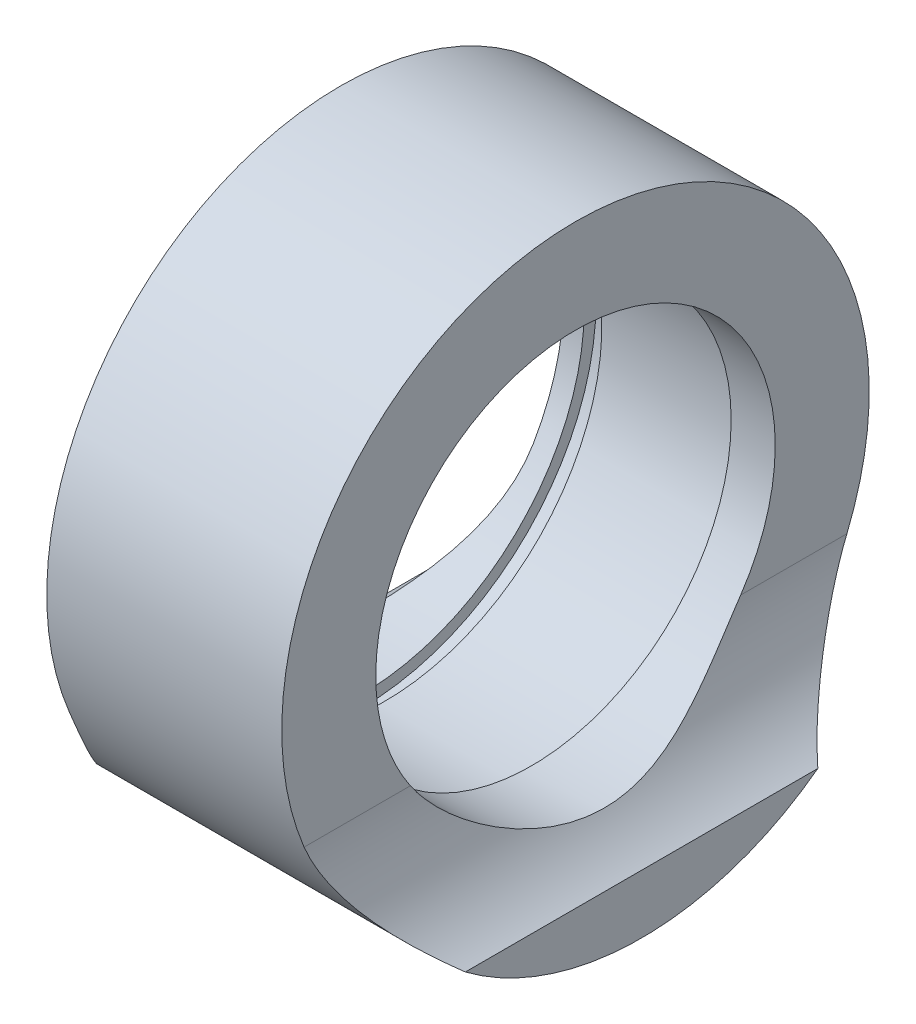
ISO-10303-21;
HEADER;
FILE_DESCRIPTION(('STEP AP214'),'2;1');
FILE_NAME('part.step','',(''),(''),'','','');
FILE_SCHEMA(('AUTOMOTIVE_DESIGN { 1 0 10303 214 1 1 1 1 }'));
ENDSEC;
DATA;
#1=APPLICATION_CONTEXT('core data for automotive mechanical design processes');
#2=APPLICATION_PROTOCOL_DEFINITION('international standard','automotive_design',2000,#1);
#3=PRODUCT_CONTEXT('',#1,'mechanical');
#4=PRODUCT('Part','Part','',(#3));
#5=PRODUCT_RELATED_PRODUCT_CATEGORY('part','',(#4));
#6=PRODUCT_DEFINITION_FORMATION('','',#4);
#7=PRODUCT_DEFINITION_CONTEXT('part definition',#1,'design');
#8=PRODUCT_DEFINITION('design','',#6,#7);
#9=PRODUCT_DEFINITION_SHAPE('','',#8);
#10=(LENGTH_UNIT() NAMED_UNIT(*) SI_UNIT(.MILLI.,.METRE.));
#11=(NAMED_UNIT(*) PLANE_ANGLE_UNIT() SI_UNIT($,.RADIAN.));
#12=(NAMED_UNIT(*) SI_UNIT($,.STERADIAN.) SOLID_ANGLE_UNIT());
#13=UNCERTAINTY_MEASURE_WITH_UNIT(LENGTH_MEASURE(1.E-05),#10,'distance_accuracy_value','');
#14=(GEOMETRIC_REPRESENTATION_CONTEXT(3) GLOBAL_UNCERTAINTY_ASSIGNED_CONTEXT((#13)) GLOBAL_UNIT_ASSIGNED_CONTEXT((#10,
#11,#12)) REPRESENTATION_CONTEXT('',''));
#15=CARTESIAN_POINT('',(0.,0.,0.));
#16=DIRECTION('',(0.,0.,1.));
#17=DIRECTION('',(1.,0.,0.));
#18=AXIS2_PLACEMENT_3D('',#15,#16,#17);
#19=CARTESIAN_POINT('',(0.,0.,0.));
#20=DIRECTION('',(-1.,0.,0.));
#21=DIRECTION('',(0.,0.,1.));
#22=AXIS2_PLACEMENT_3D('',#19,#20,#21);
#23=CYLINDRICAL_SURFACE('',#22,8.636);
#24=CARTESIAN_POINT('',(11.1125,0.,0.));
#25=DIRECTION('',(-1.,0.,0.));
#26=DIRECTION('',(0.,0.,1.));
#27=AXIS2_PLACEMENT_3D('',#24,#25,#26);
#28=CIRCLE('',#27,8.636);
#29=CARTESIAN_POINT('',(11.1125,0.,8.636));
#30=VERTEX_POINT('',#29);
#31=EDGE_CURVE('E114',#30,#30,#28,.T.);
#32=ORIENTED_EDGE('',*,*,#31,.T.);
#33=EDGE_LOOP('',(#32));
#34=FACE_BOUND('',#33,.T.);
#35=CARTESIAN_POINT('',(15.875,0.446591111191196,-8.62444504761929));
#36=CARTESIAN_POINT('',(15.7386835932606,0.356840111444014,-8.62908837791533));
#37=CARTESIAN_POINT('',(15.6058029292573,0.261777067663631,-8.6326104311476));
#38=CARTESIAN_POINT('',(15.3476728732243,0.061640290897859,-8.63636131849415));
#39=CARTESIAN_POINT('',(15.2224267012754,-0.0434376189138688,-8.63658877245093));
#40=CARTESIAN_POINT('',(14.9800981710596,-0.263225367313131,-8.63268862563732));
#41=CARTESIAN_POINT('',(14.8630399493304,-0.377961653112279,-8.62854868357998));
#42=CARTESIAN_POINT('',(14.6383005330475,-0.61595574163504,-8.61483011001896));
#43=CARTESIAN_POINT('',(14.5306179648788,-0.739212291302738,-8.60525227676542));
#44=CARTESIAN_POINT('',(14.3249950767909,-0.993738360237318,-8.57959180813219));
#45=CARTESIAN_POINT('',(14.2270923298923,-1.12503587549605,-8.5634852040398));
#46=CARTESIAN_POINT('',(14.0421861092395,-1.39402299325228,-8.52382957690333));
#47=CARTESIAN_POINT('',(13.9551817675209,-1.531712085517,-8.50028114706364));
#48=CARTESIAN_POINT('',(13.7927996373322,-1.8118127766683,-8.44500803920571));
#49=CARTESIAN_POINT('',(13.7173973883662,-1.95421364915758,-8.41330095010709));
#50=CARTESIAN_POINT('',(13.578374257973,-2.24248837109038,-8.34109179197295));
#51=CARTESIAN_POINT('',(13.5147525006629,-2.38836196142545,-8.30059037728497));
#52=CARTESIAN_POINT('',(13.4031062845983,-2.67259877804348,-8.21330545907054));
#53=CARTESIAN_POINT('',(13.3543457652233,-2.81084751233822,-8.16708749125598));
#54=CARTESIAN_POINT('',(13.2671755575948,-3.08763879038732,-8.06651479957894));
#55=CARTESIAN_POINT('',(13.2287654241793,-3.22618132124732,-8.01216042581348));
#56=CARTESIAN_POINT('',(13.1619804431395,-3.50236745000247,-7.89534143479578));
#57=CARTESIAN_POINT('',(13.1336123607673,-3.6400103807998,-7.83287138866328));
#58=CARTESIAN_POINT('',(13.0864684844619,-3.91312108365166,-7.70006745370994));
#59=CARTESIAN_POINT('',(13.0676930011197,-4.04858878513869,-7.62973331035375));
#60=CARTESIAN_POINT('',(13.039039445284,-4.31691098390736,-7.48120306433948));
#61=CARTESIAN_POINT('',(13.0292022571077,-4.44975078133122,-7.40297263598532));
#62=CARTESIAN_POINT('',(13.0178135698941,-4.71133788168945,-7.23930992224698));
#63=CARTESIAN_POINT('',(13.016265263719,-4.84008358860819,-7.15387487452615));
#64=CARTESIAN_POINT('',(13.0206296184562,-5.09270269643648,-6.9762964130303));
#65=CARTESIAN_POINT('',(13.0265417365652,-5.21657645114186,-6.88415348776455));
#66=CARTESIAN_POINT('',(13.0449520783449,-5.45891928589762,-6.69361417757654));
#67=CARTESIAN_POINT('',(13.0574516785455,-5.57738723071792,-6.5952164894303));
#68=CARTESIAN_POINT('',(13.0952308697126,-5.86175917005443,-6.34591617290475));
#69=CARTESIAN_POINT('',(13.1237454777848,-6.02436070256196,-6.19171635611456));
#70=CARTESIAN_POINT('',(13.1902011265302,-6.33620374625878,-5.87221461771951));
#71=CARTESIAN_POINT('',(13.2281458271049,-6.48544003961799,-5.70690840384285));
#72=CARTESIAN_POINT('',(13.3108653687393,-6.77026431550994,-5.36595420106999));
#73=CARTESIAN_POINT('',(13.3556544057455,-6.90582293568344,-5.19028519454096));
#74=CARTESIAN_POINT('',(13.4493729495069,-7.16255468970004,-4.82983132116994));
#75=CARTESIAN_POINT('',(13.4983020946299,-7.28372907776734,-4.64504725110205));
#76=CARTESIAN_POINT('',(13.5987136260332,-7.51370657092106,-4.26325797451027));
#77=CARTESIAN_POINT('',(13.6502275755501,-7.6222117348781,-4.06608168813924));
#78=CARTESIAN_POINT('',(13.7521288209307,-7.82366511831788,-3.66352840847275));
#79=CARTESIAN_POINT('',(13.8025155779437,-7.91660602946936,-3.45814761842808));
#80=CARTESIAN_POINT('',(13.8992571060266,-8.08630959689064,-3.04021183291701));
#81=CARTESIAN_POINT('',(13.9456172906767,-8.16309417885237,-2.82766702046186));
#82=CARTESIAN_POINT('',(14.0315365811996,-8.30003668030455,-2.39605831299453));
#83=CARTESIAN_POINT('',(14.0710999835619,-8.36020511817871,-2.17699863977688));
#84=CARTESIAN_POINT('',(14.1364157557333,-8.45687431911585,-1.76110153901012));
#85=CARTESIAN_POINT('',(14.1632761470136,-8.49539301493192,-1.56490764973633));
#86=CARTESIAN_POINT('',(14.2081963104874,-8.55881262088339,-1.16932974567974));
#87=CARTESIAN_POINT('',(14.2262570128608,-8.58371497038219,-0.969946070378679));
#88=CARTESIAN_POINT('',(14.2524213266798,-8.6195447837965,-0.569481708757995));
#89=CARTESIAN_POINT('',(14.2605356379583,-8.63048726556103,-0.368403080745886));
#90=CARTESIAN_POINT('',(14.266302013592,-8.63827876270813,0.0341818054022836));
#91=CARTESIAN_POINT('',(14.263954027761,-8.63512771048593,0.235688065585003));
#92=CARTESIAN_POINT('',(14.2489599967447,-8.61478954204369,0.637432088607044));
#93=CARTESIAN_POINT('',(14.2363223504963,-8.5976138733863,0.837670751833047));
#94=CARTESIAN_POINT('',(14.2015859734294,-8.54949550909761,1.23564153197928));
#95=CARTESIAN_POINT('',(14.1794869036746,-8.51855232027111,1.43337355884302));
#96=CARTESIAN_POINT('',(14.1271392932898,-8.44323706384901,1.82541224839836));
#97=CARTESIAN_POINT('',(14.0968807785084,-8.39884855237354,2.01971440660158));
#98=CARTESIAN_POINT('',(14.0299094235879,-8.29710177122301,2.40377141712323));
#99=CARTESIAN_POINT('',(13.9931938338301,-8.23973797328706,2.59352429294657));
#100=CARTESIAN_POINT('',(13.8718058099806,-8.04177152802063,3.17556668216729));
#101=CARTESIAN_POINT('',(13.7791053248842,-7.87940801392418,3.55909402358116));
#102=CARTESIAN_POINT('',(13.6379791923144,-7.59645298795817,4.11309228965697));
#103=CARTESIAN_POINT('',(13.5905686158555,-7.49550998076479,4.29428924343374));
#104=CARTESIAN_POINT('',(13.4971697815103,-7.28063504201798,4.64928511274541));
#105=CARTESIAN_POINT('',(13.4511815420772,-7.16670294203443,4.82308393230825));
#106=CARTESIAN_POINT('',(13.3627323185049,-6.92594164614846,5.16287384158015));
#107=CARTESIAN_POINT('',(13.3202769414156,-6.79909263327571,5.32885234507323));
#108=CARTESIAN_POINT('',(13.2411761597273,-6.53298395346176,5.65193623793015));
#109=CARTESIAN_POINT('',(13.2045284178938,-6.39372931448884,5.80904518030456));
#110=CARTESIAN_POINT('',(13.1392968756995,-6.10334431929646,6.11341826619848));
#111=CARTESIAN_POINT('',(13.1107055007745,-5.95222529004746,6.26069155706601));
#112=CARTESIAN_POINT('',(13.0638438607136,-5.63870317766427,6.54447776143717));
#113=CARTESIAN_POINT('',(13.0455707635691,-5.47630320451304,6.68099361862269));
#114=CARTESIAN_POINT('',(13.0242404615752,-5.17748094888718,6.9138937045802));
#115=CARTESIAN_POINT('',(13.0187497974967,-5.04302065593645,7.01257868551938));
#116=CARTESIAN_POINT('',(13.0166297227507,-4.76857008746659,7.20201491019405));
#117=CARTESIAN_POINT('',(13.019998229266,-4.62858111937717,7.29276801355413));
#118=CARTESIAN_POINT('',(13.0366237513185,-4.34406410677281,7.46574212987066));
#119=CARTESIAN_POINT('',(13.0498762059486,-4.19953818527228,7.54796705819046));
#120=CARTESIAN_POINT('',(13.0871807395849,-3.90706306188007,7.70342632797614));
#121=CARTESIAN_POINT('',(13.1112329223403,-3.75911382711473,7.77666058306311));
#122=CARTESIAN_POINT('',(13.1710609901946,-3.46027984252363,7.91417559672029));
#123=CARTESIAN_POINT('',(13.2069079873853,-3.30938264280664,7.97839858947061));
#124=CARTESIAN_POINT('',(13.2908022191941,-3.00715437433918,8.09715253984664));
#125=CARTESIAN_POINT('',(13.3388495521268,-2.85582330210215,8.15168341936389));
#126=CARTESIAN_POINT('',(13.4473685147598,-2.55449247627678,8.25107449442493));
#127=CARTESIAN_POINT('',(13.5078368552093,-2.4044923811757,8.29593724378863));
#128=CARTESIAN_POINT('',(13.6411553641944,-2.1075297974248,8.37630435299449));
#129=CARTESIAN_POINT('',(13.7140045777955,-1.96056707548274,8.4118094340535));
#130=CARTESIAN_POINT('',(13.8642475687794,-1.6851221990593,8.47105553364385));
#131=CARTESIAN_POINT('',(13.9405482297414,-1.55621274671188,8.49559477178638));
#132=CARTESIAN_POINT('',(14.1026345997315,-1.30336177058503,8.53804305409211));
#133=CARTESIAN_POINT('',(14.1884205171535,-1.17942035603643,8.55595195254716));
#134=CARTESIAN_POINT('',(14.3690207539414,-0.937456539666256,8.5858337249806));
#135=CARTESIAN_POINT('',(14.4638393928683,-0.819437011369438,8.59780374175248));
#136=CARTESIAN_POINT('',(14.6618570228486,-0.590280853529636,8.61657047110976));
#137=CARTESIAN_POINT('',(14.7650548801957,-0.479143296432244,8.62336788226094));
#138=CARTESIAN_POINT('',(15.0249762143924,-0.218630318238057,8.63459230249568));
#139=CARTESIAN_POINT('',(15.1857595163899,-0.073157585017538,8.63677259790328));
#140=CARTESIAN_POINT('',(15.4370782461694,0.131879005051615,8.6352631428738));
#141=CARTESIAN_POINT('',(15.5224280815262,0.197954247816162,8.63396796177534));
#142=CARTESIAN_POINT('',(15.6963461419522,0.325645707847543,8.63009375884582));
#143=CARTESIAN_POINT('',(15.7849136981537,0.387262843944688,8.62751500243211));
#144=CARTESIAN_POINT('',(15.875,0.446591111191195,8.62444504761929));
#145=B_SPLINE_CURVE_WITH_KNOTS('',3,(#35,#36,#37,#38,#39,#40,#41,#42,#43,#44,#45,#46,#47,#48,
#49,#50,#51,#52,#53,#54,#55,#56,#57,#58,#59,#60,#61,#62,#63,#64,#65,#66,#67,#68,#69,#70,#71,#72,
#73,#74,#75,#76,#77,#78,#79,#80,#81,#82,#83,#84,#85,#86,#87,#88,#89,#90,#91,#92,#93,#94,#95,#96,
#97,#98,#99,#100,#101,#102,#103,#104,#105,#106,#107,#108,#109,#110,#111,#112,#113,#114,#115,
#116,#117,#118,#119,#120,#121,#122,#123,#124,#125,#126,#127,#128,#129,#130,#131,#132,#133,#134,
#135,#136,#137,#138,#139,#140,#141,#142,#143,#144),.UNSPECIFIED.,.F.,.F.,(4,2,2,2,2,2,2,2,2,2,2,
2,2,2,2,2,2,2,2,2,2,2,2,2,2,2,2,2,2,2,2,2,2,2,2,2,2,2,2,2,2,2,2,2,2,2,2,2,2,2,2,2,2,2,4),(0.,
0.48973262451988,0.979670399516991,1.47099634720444,1.96225018979995,2.45532411994016,
2.94835875597723,3.44033925655577,3.9322831635399,4.39284621093674,4.85338944670844,
5.31424235904811,5.77511019202395,6.23807560375113,6.70121933608205,7.16432937308854,
7.62753622064424,8.30423310023355,8.98119302307462,9.65957659015764,10.3379009624901,
11.0298723472358,11.722167747643,12.4135174890789,13.104428582526,13.7090073993534,
14.3135222947067,14.9173863106715,15.5212532232935,16.1246277230088,16.7280238392079,
17.33216092035,17.9365558870861,19.2112299830459,19.8491632765385,20.4871048430806,
21.1260403149325,21.7647179958897,22.4027931755939,23.040693140605,23.5408610558507,
24.0409113906576,24.5407311219639,25.040555654969,25.5434506552297,26.046349708123,
26.5491157578312,27.0518430468739,27.5067041842743,27.9615753170967,28.4166650775364,
28.8716933667165,29.5207507104857,29.8444660370683,30.1681144536797),.UNSPECIFIED.);
#146=CARTESIAN_POINT('',(13.0175,-4.8567044444044,-7.14093256792854));
#147=VERTEX_POINT('',#146);
#148=CARTESIAN_POINT('',(13.0175,-4.8567044444044,7.14093256792854));
#149=VERTEX_POINT('',#148);
#150=EDGE_CURVE('E111',#147,#149,#145,.T.);
#151=ORIENTED_EDGE('',*,*,#150,.F.);
#152=CARTESIAN_POINT('',(13.0175,0.,0.));
#153=DIRECTION('',(-1.,0.,0.));
#154=DIRECTION('',(0.,-1.,0.));
#155=AXIS2_PLACEMENT_3D('',#152,#153,#154);
#156=CIRCLE('',#155,8.636);
#157=EDGE_CURVE('E105',#147,#149,#156,.F.);
#158=ORIENTED_EDGE('',*,*,#157,.T.);
#159=EDGE_LOOP('',(#151,#158));
#160=FACE_BOUND('',#159,.T.);
#161=ADVANCED_FACE('F38',(#34,#160),#23,.F.);
#162=CARTESIAN_POINT('',(0.,0.,0.));
#163=DIRECTION('',(-1.,0.,0.));
#164=DIRECTION('',(0.,0.,1.));
#165=AXIS2_PLACEMENT_3D('',#162,#163,#164);
#166=CYLINDRICAL_SURFACE('',#165,9.652);
#167=CARTESIAN_POINT('',(2.8575,-4.8567044444044,-8.3410746273908));
#168=CARTESIAN_POINT('',(2.85750036353043,-4.95083609844795,-8.28626756260821));
#169=CARTESIAN_POINT('',(2.85540678181921,-5.04401631588028,-8.22987562631701));
#170=CARTESIAN_POINT('',(2.84729008677914,-5.22827375131148,-8.11406737343164));
#171=CARTESIAN_POINT('',(2.84126791739386,-5.31935146904812,-8.05465178650783));
#172=CARTESIAN_POINT('',(2.81772645001285,-5.58882975935709,-7.87229601799823));
#173=CARTESIAN_POINT('',(2.7947300534072,-5.76386219518894,-7.7450213946663));
#174=CARTESIAN_POINT('',(2.73659111079274,-6.10168701824968,-7.48170389774659));
#175=CARTESIAN_POINT('',(2.7015917509938,-6.26459731858805,-7.34577911959251));
#176=CARTESIAN_POINT('',(2.6214042910151,-6.57982313971273,-7.06481695102576));
#177=CARTESIAN_POINT('',(2.57621035185196,-6.73213252310679,-6.91977437283557));
#178=CARTESIAN_POINT('',(2.46377416853639,-7.06681540978969,-6.57974004442645));
#179=CARTESIAN_POINT('',(2.39390212711183,-7.24565696217007,-6.38213887651051));
#180=CARTESIAN_POINT('',(2.2445837514548,-7.5848386013325,-5.97507834080445));
#181=CARTESIAN_POINT('',(2.16513570940581,-7.74517537789919,-5.76561686134836));
#182=CARTESIAN_POINT('',(1.99984636286606,-8.04835696205915,-5.33432709977368));
#183=CARTESIAN_POINT('',(1.91396287396579,-8.19106649022123,-5.11242015169948));
#184=CARTESIAN_POINT('',(1.74023123301366,-8.457582030794,-4.65829724381678));
#185=CARTESIAN_POINT('',(1.6523831516039,-8.58138872165692,-4.42608165438775));
#186=CARTESIAN_POINT('',(1.47661129105896,-8.81297910591693,-3.94532403972806));
#187=CARTESIAN_POINT('',(1.38874752718321,-8.92024962136234,-3.69651214944132));
#188=CARTESIAN_POINT('',(1.22051195662432,-9.11422800645457,-3.18840126227144));
#189=CARTESIAN_POINT('',(1.14014207095172,-9.20093061238911,-2.92909960069093));
#190=CARTESIAN_POINT('',(0.993415714585421,-9.3522692404105,-2.40224121202657));
#191=CARTESIAN_POINT('',(0.926967102536427,-9.41705222193878,-2.13475312664715));
#192=CARTESIAN_POINT('',(0.8139455951946,-9.52394830360578,-1.59122532987488));
#193=CARTESIAN_POINT('',(0.767353568077309,-9.56608323542061,-1.3151941261546));
#194=CARTESIAN_POINT('',(0.711091033358099,-9.61624164334865,-0.850811768313219));
#195=CARTESIAN_POINT('',(0.694283015286361,-9.63096138273881,-0.664024529896479));
#196=CARTESIAN_POINT('',(0.673065221921821,-9.64948879116847,-0.289210542593537));
#197=CARTESIAN_POINT('',(0.668653097958747,-9.65329852734672,-0.101184035281722));
#198=CARTESIAN_POINT('',(0.672541313410604,-9.64992196665508,0.274661879844039));
#199=CARTESIAN_POINT('',(0.680843595795088,-9.64273398915453,0.462481251614801));
#200=CARTESIAN_POINT('',(0.709588018553937,-9.6175144456543,0.836459176471489));
#201=CARTESIAN_POINT('',(0.730032269832647,-9.59948099414148,1.02261743505631));
#202=CARTESIAN_POINT('',(0.787778775868454,-9.54749939245063,1.43490504467408));
#203=CARTESIAN_POINT('',(0.82789012762731,-9.51083127026773,1.66029776612879));
#204=CARTESIAN_POINT('',(0.92129864988757,-9.42233609649444,2.10528180418994));
#205=CARTESIAN_POINT('',(0.974600271973019,-9.37050392611134,2.32487113446143));
#206=CARTESIAN_POINT('',(1.09109213411,-9.25216795322985,2.75848496372553));
#207=CARTESIAN_POINT('',(1.15432704221123,-9.18559729236236,2.97247896890598));
#208=CARTESIAN_POINT('',(1.28712642266478,-9.0385092817727,3.39355241465272));
#209=CARTESIAN_POINT('',(1.35669106471202,-8.95799155808901,3.60063166963673));
#210=CARTESIAN_POINT('',(1.51817760260565,-8.76003408872849,4.06223316005146));
#211=CARTESIAN_POINT('',(1.61110596681953,-8.63847772419559,4.31464430407335));
#212=CARTESIAN_POINT('',(1.79692116944358,-8.37390280339597,4.80803758167438));
#213=CARTESIAN_POINT('',(1.88980799245034,-8.23087908221755,5.04901694642642));
#214=CARTESIAN_POINT('',(2.0702261397705,-7.92428644676172,5.51767814047522));
#215=CARTESIAN_POINT('',(2.15778321115176,-7.76083029882827,5.74542360906257));
#216=CARTESIAN_POINT('',(2.3234949550558,-7.41284094838627,6.18789600041203));
#217=CARTESIAN_POINT('',(2.40165164353241,-7.22831228157999,6.40262570954425));
#218=CARTESIAN_POINT('',(2.52950587553126,-6.87792618600909,6.77545348740315));
#219=CARTESIAN_POINT('',(2.58176216308138,-6.71584267334906,6.9362206836244));
#220=CARTESIAN_POINT('',(2.67481404748843,-6.37895822314718,7.24724171139723));
#221=CARTESIAN_POINT('',(2.71561733692324,-6.20416592148034,7.39750254852122));
#222=CARTESIAN_POINT('',(2.78359020214787,-5.84045847562794,7.68796876201738));
#223=CARTESIAN_POINT('',(2.81060117862108,-5.65140653249302,7.82804194547826));
#224=CARTESIAN_POINT('',(2.83832108693089,-5.35949365633693,8.02813274854067));
#225=CARTESIAN_POINT('',(2.84542914025389,-5.26067203081772,8.09323459469266));
#226=CARTESIAN_POINT('',(2.85501956185019,-5.06051249774506,8.21987565240766));
#227=CARTESIAN_POINT('',(2.85750050543451,-4.95917382492063,8.2814137610452));
#228=CARTESIAN_POINT('',(2.85750000000002,-4.85670444440441,8.3410746273908));
#229=B_SPLINE_CURVE_WITH_KNOTS('',3,(#167,#168,#169,#170,#171,#172,#173,#174,#175,#176,#177,
#178,#179,#180,#181,#182,#183,#184,#185,#186,#187,#188,#189,#190,#191,#192,#193,#194,#195,#196,
#197,#198,#199,#200,#201,#202,#203,#204,#205,#206,#207,#208,#209,#210,#211,#212,#213,#214,#215,
#216,#217,#218,#219,#220,#221,#222,#223,#224,#225,#226,#227,#228),.UNSPECIFIED.,.F.,.F.,(4,2,2,
2,2,2,2,2,2,2,2,2,2,2,2,2,2,2,2,2,2,2,2,2,2,2,2,2,2,2,4),(0.,0.326694497859028,
0.653310527915127,1.30520539383301,1.94957959503909,2.59432380531761,3.41969964989243,
4.24522291321366,5.07673267628726,5.90821258816336,6.7617865300416,7.61557868234333,
8.46352760706684,9.31065767553498,9.8743555650532,10.4379466426079,11.0016238547056,
11.5653990918546,12.2598503070285,12.9545362129261,13.6524404644468,14.3503634317173,
15.2348073813872,16.1194644648424,16.9994385086999,17.8792235004589,18.5810402712931,
19.2823845221846,19.9916215886904,20.347125923302,20.7027396997849),.UNSPECIFIED.);
#230=CARTESIAN_POINT('',(2.8575,-4.8567044444044,-8.3410746273908));
#231=VERTEX_POINT('',#230);
#232=CARTESIAN_POINT('',(2.8575,-4.8567044444044,8.3410746273908));
#233=VERTEX_POINT('',#232);
#234=EDGE_CURVE('E47',#231,#233,#229,.T.);
#235=ORIENTED_EDGE('',*,*,#234,.T.);
#236=CARTESIAN_POINT('',(2.8575,0.,0.));
#237=DIRECTION('',(1.,0.,0.));
#238=DIRECTION('',(0.,1.,0.));
#239=AXIS2_PLACEMENT_3D('',#236,#237,#238);
#240=CIRCLE('',#239,9.652);
#241=EDGE_CURVE('E11',#233,#231,#240,.F.);
#242=ORIENTED_EDGE('',*,*,#241,.T.);
#243=EDGE_LOOP('',(#235,#242));
#244=FACE_BOUND('',#243,.T.);
#245=CARTESIAN_POINT('',(3.7465,0.,0.));
#246=DIRECTION('',(-1.,0.,0.));
#247=DIRECTION('',(0.,0.,1.));
#248=AXIS2_PLACEMENT_3D('',#245,#246,#247);
#249=CIRCLE('',#248,9.652);
#250=CARTESIAN_POINT('',(3.7465,0.,9.652));
#251=VERTEX_POINT('',#250);
#252=EDGE_CURVE('E134',#251,#251,#249,.T.);
#253=ORIENTED_EDGE('',*,*,#252,.F.);
#254=EDGE_LOOP('',(#253));
#255=FACE_BOUND('',#254,.T.);
#256=ADVANCED_FACE('F147',(#244,#255),#166,.F.);
#257=CARTESIAN_POINT('',(3.7465,0.,-10.16));
#258=DIRECTION('',(-1.,0.,0.));
#259=DIRECTION('',(0.,0.,1.));
#260=AXIS2_PLACEMENT_3D('',#257,#258,#259);
#261=PLANE('',#260);
#262=CARTESIAN_POINT('',(3.7465,0.,0.));
#263=DIRECTION('',(-1.,0.,0.));
#264=DIRECTION('',(0.,0.,1.));
#265=AXIS2_PLACEMENT_3D('',#262,#263,#264);
#266=CIRCLE('',#265,10.16);
#267=CARTESIAN_POINT('',(3.7465,0.,10.16));
#268=VERTEX_POINT('',#267);
#269=EDGE_CURVE('E131',#268,#268,#266,.T.);
#270=ORIENTED_EDGE('',*,*,#269,.F.);
#271=EDGE_LOOP('',(#270));
#272=FACE_BOUND('',#271,.T.);
#273=ORIENTED_EDGE('',*,*,#252,.T.);
#274=EDGE_LOOP('',(#273));
#275=FACE_BOUND('',#274,.T.);
#276=ADVANCED_FACE('F216',(#272,#275),#261,.F.);
#277=CARTESIAN_POINT('',(0.,0.,0.));
#278=DIRECTION('',(-1.,0.,0.));
#279=DIRECTION('',(0.,0.,1.));
#280=AXIS2_PLACEMENT_3D('',#277,#278,#279);
#281=CYLINDRICAL_SURFACE('',#280,10.16);
#282=CARTESIAN_POINT('',(4.7625,0.,0.));
#283=DIRECTION('',(-1.,0.,0.));
#284=DIRECTION('',(0.,0.,1.));
#285=AXIS2_PLACEMENT_3D('',#282,#283,#284);
#286=CIRCLE('',#285,10.16);
#287=CARTESIAN_POINT('',(4.7625,0.,10.16));
#288=VERTEX_POINT('',#287);
#289=EDGE_CURVE('E128',#288,#288,#286,.T.);
#290=ORIENTED_EDGE('',*,*,#289,.F.);
#291=EDGE_LOOP('',(#290));
#292=FACE_BOUND('',#291,.T.);
#293=ORIENTED_EDGE('',*,*,#269,.T.);
#294=EDGE_LOOP('',(#293));
#295=FACE_BOUND('',#294,.T.);
#296=ADVANCED_FACE('F238',(#292,#295),#281,.F.);
#297=CARTESIAN_POINT('',(4.7625,0.,-9.398));
#298=DIRECTION('',(1.,0.,0.));
#299=DIRECTION('',(0.,0.,-1.));
#300=AXIS2_PLACEMENT_3D('',#297,#298,#299);
#301=PLANE('',#300);
#302=CARTESIAN_POINT('',(4.7625,0.,0.));
#303=DIRECTION('',(-1.,0.,0.));
#304=DIRECTION('',(0.,0.,1.));
#305=AXIS2_PLACEMENT_3D('',#302,#303,#304);
#306=CIRCLE('',#305,9.398);
#307=CARTESIAN_POINT('',(4.7625,0.,9.398));
#308=VERTEX_POINT('',#307);
#309=EDGE_CURVE('E125',#308,#308,#306,.T.);
#310=ORIENTED_EDGE('',*,*,#309,.F.);
#311=EDGE_LOOP('',(#310));
#312=FACE_BOUND('',#311,.T.);
#313=ORIENTED_EDGE('',*,*,#289,.T.);
#314=EDGE_LOOP('',(#313));
#315=FACE_BOUND('',#314,.T.);
#316=ADVANCED_FACE('F231',(#312,#315),#301,.F.);
#317=CARTESIAN_POINT('',(0.,0.,0.));
#318=DIRECTION('',(-1.,0.,0.));
#319=DIRECTION('',(0.,0.,1.));
#320=AXIS2_PLACEMENT_3D('',#317,#318,#319);
#321=CYLINDRICAL_SURFACE('',#320,9.398);
#322=CARTESIAN_POINT('',(11.1125,0.,0.));
#323=DIRECTION('',(-1.,0.,0.));
#324=DIRECTION('',(0.,0.,1.));
#325=AXIS2_PLACEMENT_3D('',#322,#323,#324);
#326=CIRCLE('',#325,9.398);
#327=CARTESIAN_POINT('',(11.1125,0.,9.398));
#328=VERTEX_POINT('',#327);
#329=EDGE_CURVE('E118',#328,#328,#326,.T.);
#330=ORIENTED_EDGE('',*,*,#329,.F.);
#331=EDGE_LOOP('',(#330));
#332=FACE_BOUND('',#331,.T.);
#333=ORIENTED_EDGE('',*,*,#309,.T.);
#334=EDGE_LOOP('',(#333));
#335=FACE_BOUND('',#334,.T.);
#336=ADVANCED_FACE('F226',(#332,#335),#321,.F.);
#337=CARTESIAN_POINT('',(11.1125,0.,-9.398));
#338=DIRECTION('',(1.,0.,0.));
#339=DIRECTION('',(0.,0.,-1.));
#340=AXIS2_PLACEMENT_3D('',#337,#338,#339);
#341=PLANE('',#340);
#342=ORIENTED_EDGE('',*,*,#31,.F.);
#343=EDGE_LOOP('',(#342));
#344=FACE_BOUND('',#343,.T.);
#345=ORIENTED_EDGE('',*,*,#329,.T.);
#346=EDGE_LOOP('',(#345));
#347=FACE_BOUND('',#346,.T.);
#348=ADVANCED_FACE('F223',(#344,#347),#341,.F.);
#349=CARTESIAN_POINT('',(13.0175,0.,-12.7));
#350=DIRECTION('',(-1.,0.,0.));
#351=DIRECTION('',(0.,-1.,0.));
#352=AXIS2_PLACEMENT_3D('',#349,#350,#351);
#353=PLANE('',#352);
#354=DIRECTION('',(0.,0.,1.));
#355=VECTOR('',#354,1.);
#356=CARTESIAN_POINT('',(13.0175,-4.8567044444044,-12.7));
#357=LINE('',#356,#355);
#358=CARTESIAN_POINT('',(13.0175,-4.8567044444044,11.7346675257419));
#359=VERTEX_POINT('',#358);
#360=EDGE_CURVE('E182',#149,#359,#357,.T.);
#361=ORIENTED_EDGE('',*,*,#360,.F.);
#362=ORIENTED_EDGE('',*,*,#157,.F.);
#363=CARTESIAN_POINT('',(13.0175,-4.8567044444044,-11.7346675257419));
#364=VERTEX_POINT('',#363);
#365=EDGE_CURVE('E178',#364,#147,#357,.T.);
#366=ORIENTED_EDGE('',*,*,#365,.F.);
#367=CARTESIAN_POINT('',(13.0175,0.,0.));
#368=DIRECTION('',(-1.,0.,0.));
#369=DIRECTION('',(0.,-1.,0.));
#370=AXIS2_PLACEMENT_3D('',#367,#368,#369);
#371=CIRCLE('',#370,12.7);
#372=EDGE_CURVE('E110',#359,#364,#371,.T.);
#373=ORIENTED_EDGE('',*,*,#372,.F.);
#374=EDGE_LOOP('',(#361,#362,#366,#373));
#375=FACE_BOUND('',#374,.T.);
#376=ADVANCED_FACE('F156',(#375),#353,.F.);
#377=CARTESIAN_POINT('',(19.3675,-4.8567044444044,-12.7));
#378=DIRECTION('',(0.,0.,1.));
#379=DIRECTION('',(1.,0.,0.));
#380=AXIS2_PLACEMENT_3D('',#377,#378,#379);
#381=CYLINDRICAL_SURFACE('',#380,6.35);
#382=CARTESIAN_POINT('',(15.875,0.446591111191196,12.6921454600633));
#383=CARTESIAN_POINT('',(15.7321810870004,0.352559299351361,12.6954511995327));
#384=CARTESIAN_POINT('',(15.5931587693577,0.252714468512677,12.6979212886488));
#385=CARTESIAN_POINT('',(15.3235766246233,0.0421101794449137,12.7003676003551));
#386=CARTESIAN_POINT('',(15.193018507516,-0.0686514729399959,12.7003433205804));
#387=CARTESIAN_POINT('',(14.9411601773139,-0.300461146649926,12.696974566672));
#388=CARTESIAN_POINT('',(14.8198698274594,-0.421519844966402,12.6936266068833));
#389=CARTESIAN_POINT('',(14.5875575671271,-0.672933811801876,12.6827831312891));
#390=CARTESIAN_POINT('',(14.4765347771631,-0.803288282377641,12.6752879711043));
#391=CARTESIAN_POINT('',(14.2653046984389,-1.07259913148515,12.6553465743102));
#392=CARTESIAN_POINT('',(14.1651216091258,-1.21157370951669,12.6428895390496));
#393=CARTESIAN_POINT('',(13.9765596999276,-1.49672282386348,12.6123105174089));
#394=CARTESIAN_POINT('',(13.888180596729,-1.64289718725767,12.594188667028));
#395=CARTESIAN_POINT('',(13.7239135729323,-1.94099573896002,12.5516998943017));
#396=CARTESIAN_POINT('',(13.6480101743625,-2.09291251055008,12.527340807681));
#397=CARTESIAN_POINT('',(13.5089943154435,-2.40129912521664,12.4719004162863));
#398=CARTESIAN_POINT('',(13.4458813342701,-2.55776878260335,12.4408193853357));
#399=CARTESIAN_POINT('',(13.3347077262139,-2.86820561534786,12.372863026191));
#400=CARTESIAN_POINT('',(13.2861913256039,-3.02206366010414,12.336233287566));
#401=CARTESIAN_POINT('',(13.2013154571189,-3.3314479243372,12.2563040062588));
#402=CARTESIAN_POINT('',(13.1649600708287,-3.48697468584383,12.2130022313581));
#403=CARTESIAN_POINT('',(13.1043021102768,-3.79839370091038,12.1197618424479));
#404=CARTESIAN_POINT('',(13.0800004288292,-3.95428598068512,12.0698227371606));
#405=CARTESIAN_POINT('',(13.0431602588531,-4.26529923511444,11.9634545858704));
#406=CARTESIAN_POINT('',(13.0306261576621,-4.42041990066291,11.9070231281019));
#407=CARTESIAN_POINT('',(13.0168121641753,-4.731042446527,11.7870846394362));
#408=CARTESIAN_POINT('',(13.0157013268361,-4.88651608267872,11.7234853683752));
#409=CARTESIAN_POINT('',(13.0246228382969,-5.1945957497263,11.5902698896479));
#410=CARTESIAN_POINT('',(13.0346595979174,-5.34720062122135,11.5206513103485));
#411=CARTESIAN_POINT('',(13.0652548792815,-5.64863324935234,11.3758907320244));
#412=CARTESIAN_POINT('',(13.0858108903891,-5.79746189836956,11.3007500546251));
#413=CARTESIAN_POINT('',(13.1367846882633,-6.09074252111457,11.1454210149983));
#414=CARTESIAN_POINT('',(13.1672043595335,-6.23519365272362,11.0652316905617));
#415=CARTESIAN_POINT('',(13.2506323470538,-6.57347087143769,10.8688064658828));
#416=CARTESIAN_POINT('',(13.3078305322769,-6.76507619689603,10.7505036057806));
#417=CARTESIAN_POINT('',(13.4381368964123,-7.13797444536891,10.5066171509104));
#418=CARTESIAN_POINT('',(13.5112499669747,-7.31926417609073,10.3810313263526));
#419=CARTESIAN_POINT('',(13.6721351877348,-7.67147309400145,10.1235485658978));
#420=CARTESIAN_POINT('',(13.7599531203467,-7.84235754598117,9.99163286719353));
#421=CARTESIAN_POINT('',(13.9488021688884,-8.17279138659706,9.72320937582832));
#422=CARTESIAN_POINT('',(14.0498330107509,-8.33234101023891,9.58670167846005));
#423=CARTESIAN_POINT('',(14.273522914854,-8.65347736511801,9.29827387459318));
#424=CARTESIAN_POINT('',(14.3973020841898,-8.81401314592279,9.14605283041667));
#425=CARTESIAN_POINT('',(14.6584370771283,-9.1214337882574,8.83948978784244));
#426=CARTESIAN_POINT('',(14.7957943376166,-9.26831720184358,8.68514756646482));
#427=CARTESIAN_POINT('',(15.0825521485749,-9.54727224443227,8.37748989105898));
#428=CARTESIAN_POINT('',(15.2318492418092,-9.67945149340203,8.22417593256284));
#429=CARTESIAN_POINT('',(15.4655577734001,-9.86742629352902,7.99585070484165));
#430=CARTESIAN_POINT('',(15.545083453054,-9.92836603050094,7.92002041320923));
#431=CARTESIAN_POINT('',(15.707496528174,-10.0467868945394,7.76925189723856));
#432=CARTESIAN_POINT('',(15.7903841549551,-10.1042677829458,7.69431373474266));
#433=CARTESIAN_POINT('',(15.875,-10.16,7.62000000000001));
#434=B_SPLINE_CURVE_WITH_KNOTS('',3,(#382,#383,#384,#385,#386,#387,#388,#389,#390,#391,#392,
#393,#394,#395,#396,#397,#398,#399,#400,#401,#402,#403,#404,#405,#406,#407,#408,#409,#410,#411,
#412,#413,#414,#415,#416,#417,#418,#419,#420,#421,#422,#423,#424,#425,#426,#427,#428,#429,#430,
#431,#432,#433),.UNSPECIFIED.,.F.,.F.,(4,2,2,2,2,2,2,2,2,2,2,2,2,2,2,2,2,2,2,2,2,2,2,2,2,4),(0.,
0.51295394875192,1.02601120641851,1.53960709351461,2.05315894680888,2.56783461633074,
3.08249793063651,3.59651782831331,4.11051679095466,4.60622241487767,5.10209424526229,
5.59800279923177,6.09409617073288,6.59752093572435,7.10114496406875,7.60464884818848,
8.10824898608212,8.80425003607181,9.50046531401022,10.1988899406021,10.897300082486,
11.6570270313048,12.416834463572,13.1706531697246,13.5475240114268,13.9244208274353),.UNSPECIFIED.);
#435=CARTESIAN_POINT('',(15.875,-10.16,7.62000000000001));
#436=VERTEX_POINT('',#435);
#437=EDGE_CURVE('E101',#359,#436,#434,.T.);
#438=ORIENTED_EDGE('',*,*,#437,.T.);
#439=DIRECTION('',(0.,0.,1.));
#440=VECTOR('',#439,1.);
#441=CARTESIAN_POINT('',(15.875,-10.16,-12.7));
#442=LINE('',#441,#440);
#443=CARTESIAN_POINT('',(15.875,-10.16,-7.62000000000001));
#444=VERTEX_POINT('',#443);
#445=EDGE_CURVE('E93',#436,#444,#442,.F.);
#446=ORIENTED_EDGE('',*,*,#445,.T.);
#447=CARTESIAN_POINT('',(15.875,-10.16,-7.62000000000001));
#448=CARTESIAN_POINT('',(15.7846857509187,-10.1005120620661,-7.69932452957736));
#449=CARTESIAN_POINT('',(15.696328161254,-10.0390268556461,-7.77936260081077));
#450=CARTESIAN_POINT('',(15.5234374996313,-9.91211873771602,-7.94042714110845));
#451=CARTESIAN_POINT('',(15.4389041481394,-9.84669611483007,-8.0214535373793));
#452=CARTESIAN_POINT('',(15.2735196483681,-9.7119284167614,-8.18410743540627));
#453=CARTESIAN_POINT('',(15.1926703158945,-9.64258144427342,-8.2657352110339));
#454=CARTESIAN_POINT('',(15.0346731088536,-9.50002569245911,-8.42919192299283));
#455=CARTESIAN_POINT('',(14.9575253235006,-9.42681682014288,-8.51102086412269));
#456=CARTESIAN_POINT('',(14.7304706543939,-9.20025614833976,-8.75758723993542));
#457=CARTESIAN_POINT('',(14.5862041693215,-9.04099012103136,-8.92216335540419));
#458=CARTESIAN_POINT('',(14.3133328752433,-8.70694852762223,-9.24843580138801));
#459=CARTESIAN_POINT('',(14.1847243899542,-8.53217661881287,-9.4101328002389));
#460=CARTESIAN_POINT('',(13.9635203096662,-8.19634688144426,-9.70316078728525));
#461=CARTESIAN_POINT('',(13.8684529256179,-8.03755153849158,-9.83521970438303));
#462=CARTESIAN_POINT('',(13.6912051284098,-7.70924217085041,-10.0946194288654));
#463=CARTESIAN_POINT('',(13.6090242089966,-7.53972856760333,-10.2219604214466));
#464=CARTESIAN_POINT('',(13.4590123139508,-7.19084720489344,-10.470311995893));
#465=CARTESIAN_POINT('',(13.3911404800927,-7.01150939695547,-10.5913398386208));
#466=CARTESIAN_POINT('',(13.270895395816,-6.64316036470566,-10.8261762104543));
#467=CARTESIAN_POINT('',(13.2185191231278,-6.45415103518345,-10.9399861439418));
#468=CARTESIAN_POINT('',(13.1390672720923,-6.10372870991326,-11.1385415656596));
#469=CARTESIAN_POINT('',(13.1090886207901,-5.94379044268601,-11.2247341910018));
#470=CARTESIAN_POINT('',(13.0612753911484,-5.61892169128585,-11.3908287715672));
#471=CARTESIAN_POINT('',(13.0434383727259,-5.45399221715008,-11.4707319879059));
#472=CARTESIAN_POINT('',(13.0207568688847,-5.12005991423544,-11.6236270966352));
#473=CARTESIAN_POINT('',(13.0159128594027,-4.95105693647205,-11.6966187357589));
#474=CARTESIAN_POINT('',(13.0199991096185,-4.61015739988853,-11.8351296143748));
#475=CARTESIAN_POINT('',(13.0289295614684,-4.4382608007358,-11.9006487496129));
#476=CARTESIAN_POINT('',(13.0613066534768,-4.09195333511391,-12.0241385623997));
#477=CARTESIAN_POINT('',(13.0848389801979,-3.91753360642489,-12.0820622200669));
#478=CARTESIAN_POINT('',(13.146955260545,-3.56880416947873,-12.1896238916379));
#479=CARTESIAN_POINT('',(13.1855393801287,-3.3944944624559,-12.2392618141766));
#480=CARTESIAN_POINT('',(13.2779510822708,-3.04782077512634,-12.3301617521829));
#481=CARTESIAN_POINT('',(13.3317721108109,-2.87545599130453,-12.3714273558551));
#482=CARTESIAN_POINT('',(13.4546037666592,-2.53442160563784,-12.4457687868945));
#483=CARTESIAN_POINT('',(13.5236129606986,-2.365751656771,-12.4788453864119));
#484=CARTESIAN_POINT('',(13.6688533239722,-2.05046499351202,-12.534297347109));
#485=CARTESIAN_POINT('',(13.7436768884032,-1.90332705886326,-12.5574111533659));
#486=CARTESIAN_POINT('',(13.9049520716664,-1.61473057557292,-12.5977726162609));
#487=CARTESIAN_POINT('',(13.9914036197813,-1.47327199239831,-12.6150203085725));
#488=CARTESIAN_POINT('',(14.1754248368024,-1.19714390856676,-12.6442132292506));
#489=CARTESIAN_POINT('',(14.2729976535819,-1.06247634574299,-12.6561569516221));
#490=CARTESIAN_POINT('',(14.478546698529,-0.801052714716761,-12.6753897725369));
#491=CARTESIAN_POINT('',(14.5865216436198,-0.674295673941085,-12.682679444302));
#492=CARTESIAN_POINT('',(14.8741981087141,-0.362363499607426,-12.6962454420493));
#493=CARTESIAN_POINT('',(15.0607571004373,-0.183281268414205,-12.6997728241821));
#494=CARTESIAN_POINT('',(15.3555108934877,0.0670215657298443,-12.700097678547));
#495=CARTESIAN_POINT('',(15.4561585969759,0.147343508272728,-12.6993809015726));
#496=CARTESIAN_POINT('',(15.6621445892195,0.301724153594663,-12.6966490683552));
#497=CARTESIAN_POINT('',(15.7674832501247,0.375782358093765,-12.6946339089358));
#498=CARTESIAN_POINT('',(15.875,0.446591111191196,-12.6921454600633));
#499=B_SPLINE_CURVE_WITH_KNOTS('',3,(#447,#448,#449,#450,#451,#452,#453,#454,#455,#456,#457,
#458,#459,#460,#461,#462,#463,#464,#465,#466,#467,#468,#469,#470,#471,#472,#473,#474,#475,#476,
#477,#478,#479,#480,#481,#482,#483,#484,#485,#486,#487,#488,#489,#490,#491,#492,#493,#494,#495,
#496,#497,#498),.UNSPECIFIED.,.F.,.F.,(4,2,2,2,2,2,2,2,2,2,2,2,2,2,2,2,2,2,2,2,2,2,2,2,2,4),(0.,
0.402310831770484,0.804592208817841,1.20706976662231,1.60955702003063,2.42062309999368,
3.23149838404299,3.91296886666496,4.59441257054784,5.27388330342026,5.9532214241469,
6.50511803820638,7.05690370578115,7.60870958510476,8.16052316212666,8.71560591507927,
9.27069478842291,9.82554525714966,10.380343388473,10.8797854207756,11.3792244157845,
11.8788051296341,12.3783243001438,13.151830264317,13.5379446946526,13.924089811533),.UNSPECIFIED.);
#500=EDGE_CURVE('E97',#444,#364,#499,.T.);
#501=ORIENTED_EDGE('',*,*,#500,.T.);
#502=ORIENTED_EDGE('',*,*,#365,.T.);
#503=ORIENTED_EDGE('',*,*,#150,.T.);
#504=ORIENTED_EDGE('',*,*,#360,.T.);
#505=EDGE_LOOP('',(#438,#446,#501,#502,#503,#504));
#506=FACE_BOUND('',#505,.T.);
#507=ADVANCED_FACE('F95',(#506),#381,.F.);
#508=CARTESIAN_POINT('',(2.8575,0.,-12.7));
#509=DIRECTION('',(1.,0.,0.));
#510=DIRECTION('',(0.,1.,0.));
#511=AXIS2_PLACEMENT_3D('',#508,#509,#510);
#512=PLANE('',#511);
#513=CARTESIAN_POINT('',(2.8575,0.,0.));
#514=DIRECTION('',(1.,0.,0.));
#515=DIRECTION('',(0.,1.,0.));
#516=AXIS2_PLACEMENT_3D('',#513,#514,#515);
#517=CIRCLE('',#516,12.7);
#518=CARTESIAN_POINT('',(2.8575,-4.8567044444044,-11.7346675257419));
#519=VERTEX_POINT('',#518);
#520=CARTESIAN_POINT('',(2.8575,-4.8567044444044,11.7346675257419));
#521=VERTEX_POINT('',#520);
#522=EDGE_CURVE('E115',#519,#521,#517,.T.);
#523=ORIENTED_EDGE('',*,*,#522,.F.);
#524=DIRECTION('',(0.,0.,1.));
#525=VECTOR('',#524,1.);
#526=CARTESIAN_POINT('',(2.8575,-4.8567044444044,-12.7));
#527=LINE('',#526,#525);
#528=EDGE_CURVE('E180',#519,#231,#527,.T.);
#529=ORIENTED_EDGE('',*,*,#528,.T.);
#530=ORIENTED_EDGE('',*,*,#241,.F.);
#531=EDGE_CURVE('E61',#233,#521,#527,.T.);
#532=ORIENTED_EDGE('',*,*,#531,.T.);
#533=EDGE_LOOP('',(#523,#529,#530,#532));
#534=FACE_BOUND('',#533,.T.);
#535=ADVANCED_FACE('F155',(#534),#512,.F.);
#536=CARTESIAN_POINT('',(-3.4925,-4.8567044444044,-12.7));
#537=DIRECTION('',(0.,0.,1.));
#538=DIRECTION('',(1.,0.,0.));
#539=AXIS2_PLACEMENT_3D('',#536,#537,#538);
#540=CYLINDRICAL_SURFACE('',#539,6.35);
#541=DIRECTION('',(0.,0.,1.));
#542=VECTOR('',#541,1.);
#543=CARTESIAN_POINT('',(0.,-10.16,-12.7));
#544=LINE('',#543,#542);
#545=CARTESIAN_POINT('',(0.,-10.16,-7.62));
#546=VERTEX_POINT('',#545);
#547=CARTESIAN_POINT('',(0.,-10.16,7.62));
#548=VERTEX_POINT('',#547);
#549=EDGE_CURVE('E177',#546,#548,#544,.T.);
#550=ORIENTED_EDGE('',*,*,#549,.T.);
#551=CARTESIAN_POINT('',(2.8575,-4.8567044444044,11.7346675257419));
#552=CARTESIAN_POINT('',(2.85751817215587,-5.04965605435503,11.6548573294305));
#553=CARTESIAN_POINT('',(2.84870885526981,-5.24050287782198,11.5702512592545));
#554=CARTESIAN_POINT('',(2.81470704110063,-5.61639872535586,11.3924944046283));
#555=CARTESIAN_POINT('',(2.78953532515205,-5.80145479201347,11.299354587329));
#556=CARTESIAN_POINT('',(2.72435382319929,-6.16312534349792,11.1061988223914));
#557=CARTESIAN_POINT('',(2.68447264006157,-6.33979844026765,11.0062484174344));
#558=CARTESIAN_POINT('',(2.59107642562917,-6.68554894694401,10.7997215320775));
#559=CARTESIAN_POINT('',(2.53755713358996,-6.85462396364533,10.6931429888308));
#560=CARTESIAN_POINT('',(2.41837975190268,-7.18360020163785,10.4749524263757));
#561=CARTESIAN_POINT('',(2.35278973254009,-7.34354658483654,10.3633711631761));
#562=CARTESIAN_POINT('',(2.21033505567213,-7.65482340842375,10.1356263132077));
#563=CARTESIAN_POINT('',(2.13347133567944,-7.8061545637971,10.0194631080564));
#564=CARTESIAN_POINT('',(1.88667336330863,-8.24804000671825,9.66450351543209));
#565=CARTESIAN_POINT('',(1.70092598233764,-8.52542780735105,9.41994815029197));
#566=CARTESIAN_POINT('',(1.39100599637814,-8.91912078058419,9.0429090369788));
#567=CARTESIAN_POINT('',(1.28009803504795,-9.04881352555451,8.9130020528351));
#568=CARTESIAN_POINT('',(1.0487021511876,-9.29843148131723,8.65226483073951));
#569=CARTESIAN_POINT('',(0.928214336803718,-9.41835680234243,8.52143460322525));
#570=CARTESIAN_POINT('',(0.678608207629107,-9.647623196832,8.26094925155171));
#571=CARTESIAN_POINT('',(0.549549318647957,-9.75702643378229,8.1312919296458));
#572=CARTESIAN_POINT('',(0.348883565075857,-9.91372633078214,7.93819296966273));
#573=CARTESIAN_POINT('',(0.280811900320844,-9.96472778849892,7.87405471023485));
#574=CARTESIAN_POINT('',(0.142241504614332,-10.0642394831543,7.74645968701749));
#575=CARTESIAN_POINT('',(0.0717426048399981,-10.1127495462205,7.68300297103614));
#576=CARTESIAN_POINT('',(0.,-10.16,7.62));
#577=B_SPLINE_CURVE_WITH_KNOTS('',3,(#551,#552,#553,#554,#555,#556,#557,#558,#559,#560,#561,
#562,#563,#564,#565,#566,#567,#568,#569,#570,#571,#572,#573,#574,#575,#576),.UNSPECIFIED.,.F.,
.F.,(4,2,2,2,2,2,2,2,2,2,2,2,4),(0.,0.626005396989314,1.25121727487292,1.87108779854828,
2.491152216765,3.10782148532271,3.72443950116078,4.96164520752839,5.60473431674432,
6.24781616720485,6.88682940380203,7.20636734970581,7.52592756568866),.UNSPECIFIED.);
#578=EDGE_CURVE('E161',#521,#548,#577,.T.);
#579=ORIENTED_EDGE('',*,*,#578,.F.);
#580=ORIENTED_EDGE('',*,*,#531,.F.);
#581=ORIENTED_EDGE('',*,*,#234,.F.);
#582=ORIENTED_EDGE('',*,*,#528,.F.);
#583=CARTESIAN_POINT('',(0.,-10.16,-7.62));
#584=CARTESIAN_POINT('',(0.0901851473812657,-10.1005971431864,-7.69921104767475));
#585=CARTESIAN_POINT('',(0.178419171967853,-10.0392027039561,-7.77913366635918));
#586=CARTESIAN_POINT('',(0.351073443394312,-9.91248732658487,-7.93996506552614));
#587=CARTESIAN_POINT('',(0.43549397068876,-9.84716667801366,-8.0208737729316));
#588=CARTESIAN_POINT('',(0.600664824692587,-9.71261268792646,-8.18329331972171));
#589=CARTESIAN_POINT('',(0.681413269341978,-9.64337737990811,-8.26480444352996));
#590=CARTESIAN_POINT('',(0.839219101395632,-9.50105573614787,-8.42802876915731));
#591=CARTESIAN_POINT('',(0.916276397914417,-9.42796930567446,-8.50974197590016));
#592=CARTESIAN_POINT('',(1.14350342791613,-9.20136607754168,-8.75642840454328));
#593=CARTESIAN_POINT('',(1.28800680145174,-9.04190711696375,-8.92124232918072));
#594=CARTESIAN_POINT('',(1.56130669328811,-8.70743843768343,-9.24798254075303));
#595=CARTESIAN_POINT('',(1.69010714255659,-8.53243262991886,-9.40990954168009));
#596=CARTESIAN_POINT('',(1.91162820725183,-8.19612119825483,-9.70335760298333));
#597=CARTESIAN_POINT('',(2.00682669546915,-8.03708380626335,-9.83560833219441));
#598=CARTESIAN_POINT('',(2.18430130875585,-7.70825369907621,-10.0953812780455));
#599=CARTESIAN_POINT('',(2.26657729994242,-7.53846087247505,-10.222903445685));
#600=CARTESIAN_POINT('',(2.41651469170673,-7.1894899345098,-10.4712374347847));
#601=CARTESIAN_POINT('',(2.48425810986363,-7.01037198685015,-10.5920838943406));
#602=CARTESIAN_POINT('',(2.60427057901977,-6.64256796488511,-10.8265348907945));
#603=CARTESIAN_POINT('',(2.65654569689619,-6.45388567594548,-10.9401422532097));
#604=CARTESIAN_POINT('',(2.75095872129797,-6.03743282809386,-11.1760993179945));
#605=CARTESIAN_POINT('',(2.79021981850812,-5.80817376608887,-11.297024567731));
#606=CARTESIAN_POINT('',(2.83018367507289,-5.45684359356977,-11.4686528511569));
#607=CARTESIAN_POINT('',(2.84035175224138,-5.33821034686016,-11.5243530563032));
#608=CARTESIAN_POINT('',(2.8540119138832,-5.09889531851584,-11.6322189125802));
#609=CARTESIAN_POINT('',(2.85750043074663,-4.97821247686997,-11.6843826605207));
#610=CARTESIAN_POINT('',(2.8575,-4.8567044444044,-11.7346675257419));
#611=B_SPLINE_CURVE_WITH_KNOTS('',3,(#583,#584,#585,#586,#587,#588,#589,#590,#591,#592,#593,
#594,#595,#596,#597,#598,#599,#600,#601,#602,#603,#604,#605,#606,#607,#608,#609,#610),
.UNSPECIFIED.,.F.,.F.,(4,2,2,2,2,2,2,2,2,2,2,2,2,4),(0.,0.401735642862981,0.8034416927742,
1.20535136145605,1.60727092109735,2.41948580081342,3.23149693663149,3.91396878818395,
4.59644770998127,5.27496721892875,5.95322024949953,6.73787565251866,7.13202994682488,
7.52639470362704),.UNSPECIFIED.);
#612=EDGE_CURVE('E54',#546,#519,#611,.T.);
#613=ORIENTED_EDGE('',*,*,#612,.F.);
#614=EDGE_LOOP('',(#550,#579,#580,#581,#582,#613));
#615=FACE_BOUND('',#614,.T.);
#616=ADVANCED_FACE('F150',(#615),#540,.F.);
#617=CARTESIAN_POINT('',(15.875,0.,-8.636));
#618=DIRECTION('',(-1.,0.,0.));
#619=DIRECTION('',(0.,0.,1.));
#620=AXIS2_PLACEMENT_3D('',#617,#618,#619);
#621=PLANE('',#620);
#622=ORIENTED_EDGE('',*,*,#445,.F.);
#623=CARTESIAN_POINT('',(15.875,0.,0.));
#624=DIRECTION('',(-1.,0.,0.));
#625=DIRECTION('',(0.,0.,1.));
#626=AXIS2_PLACEMENT_3D('',#623,#624,#625);
#627=CIRCLE('',#626,12.7);
#628=EDGE_CURVE('E109',#444,#436,#627,.T.);
#629=ORIENTED_EDGE('',*,*,#628,.F.);
#630=EDGE_LOOP('',(#622,#629));
#631=FACE_BOUND('',#630,.T.);
#632=ADVANCED_FACE('F113',(#631),#621,.F.);
#633=CARTESIAN_POINT('',(0.,0.,-12.7));
#634=DIRECTION('',(1.,0.,0.));
#635=DIRECTION('',(0.,0.,-1.));
#636=AXIS2_PLACEMENT_3D('',#633,#634,#635);
#637=PLANE('',#636);
#638=CARTESIAN_POINT('',(0.,0.,0.));
#639=DIRECTION('',(-1.,0.,0.));
#640=DIRECTION('',(0.,0.,1.));
#641=AXIS2_PLACEMENT_3D('',#638,#639,#640);
#642=CIRCLE('',#641,12.7);
#643=EDGE_CURVE('E106',#546,#548,#642,.T.);
#644=ORIENTED_EDGE('',*,*,#643,.T.);
#645=ORIENTED_EDGE('',*,*,#549,.F.);
#646=EDGE_LOOP('',(#644,#645));
#647=FACE_BOUND('',#646,.T.);
#648=ADVANCED_FACE('F176',(#647),#637,.F.);
#649=CARTESIAN_POINT('',(0.,0.,0.));
#650=DIRECTION('',(-1.,0.,0.));
#651=DIRECTION('',(0.,0.,1.));
#652=AXIS2_PLACEMENT_3D('',#649,#650,#651);
#653=CYLINDRICAL_SURFACE('',#652,12.7);
#654=ORIENTED_EDGE('',*,*,#612,.T.);
#655=ORIENTED_EDGE('',*,*,#522,.T.);
#656=ORIENTED_EDGE('',*,*,#578,.T.);
#657=ORIENTED_EDGE('',*,*,#643,.F.);
#658=EDGE_LOOP('',(#654,#655,#656,#657));
#659=FACE_BOUND('',#658,.T.);
#660=ORIENTED_EDGE('',*,*,#437,.F.);
#661=ORIENTED_EDGE('',*,*,#372,.T.);
#662=ORIENTED_EDGE('',*,*,#500,.F.);
#663=ORIENTED_EDGE('',*,*,#628,.T.);
#664=EDGE_LOOP('',(#660,#661,#662,#663));
#665=FACE_BOUND('',#664,.T.);
#666=ADVANCED_FACE('F40',(#659,#665),#653,.T.);
#667=CLOSED_SHELL('',(#161,#256,#276,#296,#316,#336,#348,#376,#507,#535,#616,#632,#648,#666));
#668=MANIFOLD_SOLID_BREP('B2',#667);
#669=ADVANCED_BREP_SHAPE_REPRESENTATION('',(#18,#668),#14);
#670=SHAPE_DEFINITION_REPRESENTATION(#9,#669);
ENDSEC;
END-ISO-10303-21;
